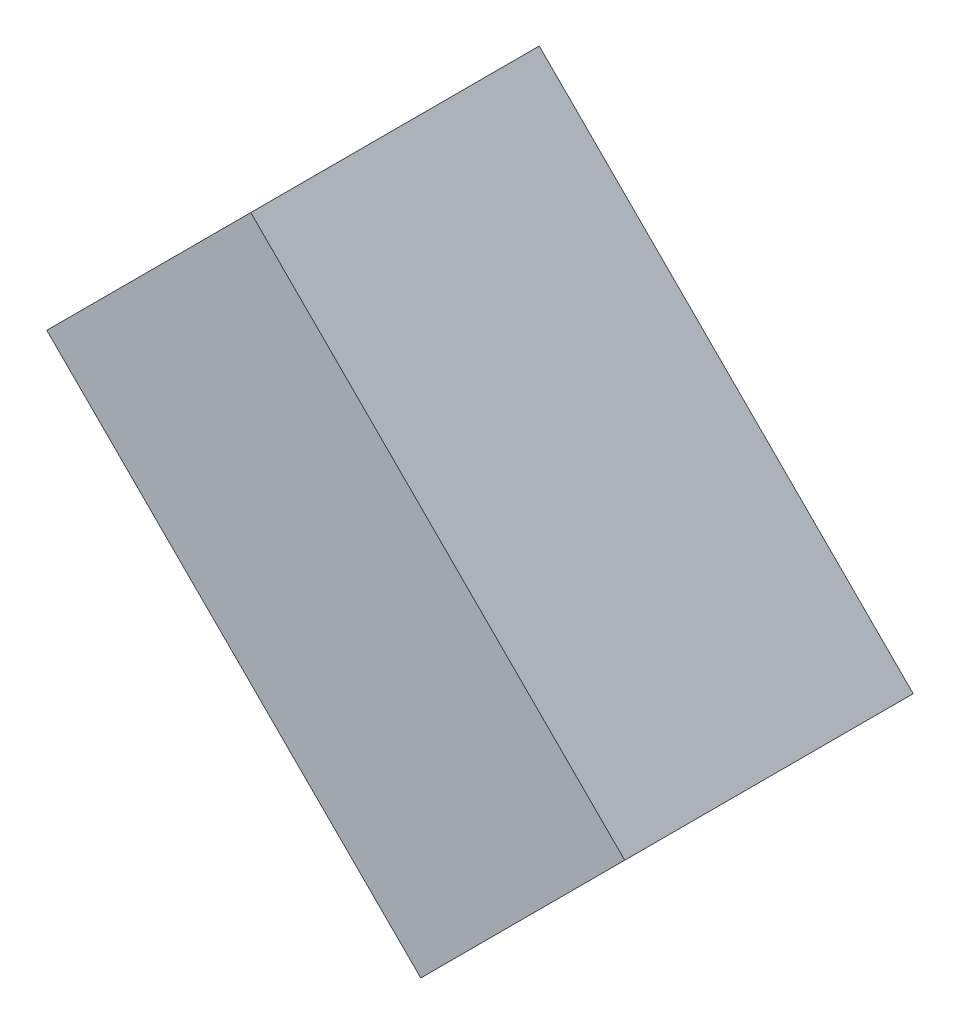
ISO-10303-21;
HEADER;
FILE_DESCRIPTION(('STEP AP214'),'2;1');
FILE_NAME('part.step','',(''),(''),'','','');
FILE_SCHEMA(('AUTOMOTIVE_DESIGN { 1 0 10303 214 1 1 1 1 }'));
ENDSEC;
DATA;
#1=APPLICATION_CONTEXT('core data for automotive mechanical design processes');
#2=APPLICATION_PROTOCOL_DEFINITION('international standard','automotive_design',2000,#1);
#3=PRODUCT_CONTEXT('',#1,'mechanical');
#4=PRODUCT('Part','Part','',(#3));
#5=PRODUCT_RELATED_PRODUCT_CATEGORY('part','',(#4));
#6=PRODUCT_DEFINITION_FORMATION('','',#4);
#7=PRODUCT_DEFINITION_CONTEXT('part definition',#1,'design');
#8=PRODUCT_DEFINITION('design','',#6,#7);
#9=PRODUCT_DEFINITION_SHAPE('','',#8);
#10=(LENGTH_UNIT() NAMED_UNIT(*) SI_UNIT(.MILLI.,.METRE.));
#11=(NAMED_UNIT(*) PLANE_ANGLE_UNIT() SI_UNIT($,.RADIAN.));
#12=(NAMED_UNIT(*) SI_UNIT($,.STERADIAN.) SOLID_ANGLE_UNIT());
#13=UNCERTAINTY_MEASURE_WITH_UNIT(LENGTH_MEASURE(1.E-05),#10,'distance_accuracy_value','');
#14=(GEOMETRIC_REPRESENTATION_CONTEXT(3) GLOBAL_UNCERTAINTY_ASSIGNED_CONTEXT((#13)) GLOBAL_UNIT_ASSIGNED_CONTEXT((#10,
#11,#12)) REPRESENTATION_CONTEXT('',''));
#15=CARTESIAN_POINT('',(0.,0.,0.));
#16=DIRECTION('',(0.,0.,1.));
#17=DIRECTION('',(1.,0.,0.));
#18=AXIS2_PLACEMENT_3D('',#15,#16,#17);
#19=CARTESIAN_POINT('',(0.26516584,-0.9015603,0.));
#20=DIRECTION('',(-0.707106011490129,-0.707107550882129,0.));
#21=DIRECTION('',(0.707107550882129,-0.707106011490129,0.));
#22=AXIS2_PLACEMENT_3D('',#19,#20,#21);
#23=PLANE('',#22);
#24=DIRECTION('',(0.,0.,1.));
#25=VECTOR('',#24,1.);
#26=CARTESIAN_POINT('',(-0.90156284,0.26516584,0.));
#27=LINE('',#26,#25);
#28=CARTESIAN_POINT('',(-0.901562839999932,0.265165840000068,0.));
#29=VERTEX_POINT('',#28);
#30=CARTESIAN_POINT('',(-0.901562839999932,0.265165840000068,0.90000074));
#31=VERTEX_POINT('',#30);
#32=EDGE_CURVE('E20',#29,#31,#27,.T.);
#33=ORIENTED_EDGE('',*,*,#32,.F.);
#34=DIRECTION('',(0.707107550882293,-0.707106011489964,0.));
#35=VECTOR('',#34,1.);
#36=CARTESIAN_POINT('',(-0.90156284,0.26516584,0.));
#37=LINE('',#36,#35);
#38=CARTESIAN_POINT('',(0.265165839999972,-0.901560299999972,0.));
#39=VERTEX_POINT('',#38);
#40=EDGE_CURVE('E81',#29,#39,#37,.T.);
#41=ORIENTED_EDGE('',*,*,#40,.T.);
#42=DIRECTION('',(0.,0.,1.));
#43=VECTOR('',#42,1.);
#44=CARTESIAN_POINT('',(0.265165839999945,-0.901560299999944,0.));
#45=LINE('',#44,#43);
#46=CARTESIAN_POINT('',(0.265165839999986,-0.901560299999986,0.90000074));
#47=VERTEX_POINT('',#46);
#48=EDGE_CURVE('E68',#47,#39,#45,.F.);
#49=ORIENTED_EDGE('',*,*,#48,.F.);
#50=DIRECTION('',(0.707107550882293,-0.707106011489964,0.));
#51=VECTOR('',#50,1.);
#52=CARTESIAN_POINT('',(-0.90156284,0.26516584,0.90000074));
#53=LINE('',#52,#51);
#54=EDGE_CURVE('E55',#31,#47,#53,.T.);
#55=ORIENTED_EDGE('',*,*,#54,.F.);
#56=EDGE_LOOP('',(#33,#41,#49,#55));
#57=FACE_BOUND('',#56,.T.);
#58=ADVANCED_FACE('F17',(#57),#23,.T.);
#59=CARTESIAN_POINT('',(-0.90156284,0.26516584,0.));
#60=DIRECTION('',(-0.707106781186548,0.707106781186548,0.));
#61=DIRECTION('',(-0.707106781186548,-0.707106781186548,0.));
#62=AXIS2_PLACEMENT_3D('',#59,#60,#61);
#63=PLANE('',#62);
#64=DIRECTION('',(0.,0.,1.));
#65=VECTOR('',#64,1.);
#66=CARTESIAN_POINT('',(-0.26516584,0.90156284,0.));
#67=LINE('',#66,#65);
#68=CARTESIAN_POINT('',(-0.26516584,0.90156284,0.));
#69=VERTEX_POINT('',#68);
#70=CARTESIAN_POINT('',(-0.26516584,0.90156284,0.90000074));
#71=VERTEX_POINT('',#70);
#72=EDGE_CURVE('E83',#69,#71,#67,.T.);
#73=ORIENTED_EDGE('',*,*,#72,.F.);
#74=DIRECTION('',(-0.707106781186547,-0.707106781186548,0.));
#75=VECTOR('',#74,1.);
#76=CARTESIAN_POINT('',(-0.26516584,0.90156284,0.));
#77=LINE('',#76,#75);
#78=EDGE_CURVE('E64',#69,#29,#77,.T.);
#79=ORIENTED_EDGE('',*,*,#78,.T.);
#80=ORIENTED_EDGE('',*,*,#32,.T.);
#81=DIRECTION('',(-0.707106781186547,-0.707106781186548,0.));
#82=VECTOR('',#81,1.);
#83=CARTESIAN_POINT('',(-0.26516584,0.90156284,0.90000074));
#84=LINE('',#83,#82);
#85=EDGE_CURVE('E61',#71,#31,#84,.T.);
#86=ORIENTED_EDGE('',*,*,#85,.F.);
#87=EDGE_LOOP('',(#73,#79,#80,#86));
#88=FACE_BOUND('',#87,.T.);
#89=ADVANCED_FACE('F60',(#88),#63,.T.);
#90=CARTESIAN_POINT('',(0.26516584,-0.9015603,0.90000074));
#91=DIRECTION('',(0.,0.,1.));
#92=DIRECTION('',(1.,0.,0.));
#93=AXIS2_PLACEMENT_3D('',#90,#91,#92);
#94=PLANE('',#93);
#95=ORIENTED_EDGE('',*,*,#85,.T.);
#96=ORIENTED_EDGE('',*,*,#54,.T.);
#97=DIRECTION('',(0.70710819229714,0.70710537007314,0.));
#98=VECTOR('',#97,1.);
#99=CARTESIAN_POINT('',(0.90156284,-0.26516584,0.90000074));
#100=LINE('',#99,#98);
#101=CARTESIAN_POINT('',(0.90156284,-0.26516584,0.90000074));
#102=VERTEX_POINT('',#101);
#103=EDGE_CURVE('E70',#102,#47,#100,.F.);
#104=ORIENTED_EDGE('',*,*,#103,.F.);
#105=DIRECTION('',(-0.707106781186548,0.707106781186548,0.));
#106=VECTOR('',#105,1.);
#107=CARTESIAN_POINT('',(-0.26516584,0.90156284,0.90000074));
#108=LINE('',#107,#106);
#109=EDGE_CURVE('E74',#71,#102,#108,.F.);
#110=ORIENTED_EDGE('',*,*,#109,.F.);
#111=EDGE_LOOP('',(#95,#96,#104,#110));
#112=FACE_BOUND('',#111,.T.);
#113=ADVANCED_FACE('F72',(#112),#94,.T.);
#114=CARTESIAN_POINT('',(0.90156284,-0.26516584,0.));
#115=DIRECTION('',(0.70710537007314,-0.70710819229714,0.));
#116=DIRECTION('',(0.70710819229714,0.70710537007314,0.));
#117=AXIS2_PLACEMENT_3D('',#114,#115,#116);
#118=PLANE('',#117);
#119=ORIENTED_EDGE('',*,*,#48,.T.);
#120=DIRECTION('',(0.707108192297078,0.707105370073201,0.));
#121=VECTOR('',#120,1.);
#122=CARTESIAN_POINT('',(0.26516584,-0.9015603,0.));
#123=LINE('',#122,#121);
#124=CARTESIAN_POINT('',(0.90156284,-0.26516584,0.));
#125=VERTEX_POINT('',#124);
#126=EDGE_CURVE('E35',#39,#125,#123,.T.);
#127=ORIENTED_EDGE('',*,*,#126,.T.);
#128=DIRECTION('',(0.,0.,1.));
#129=VECTOR('',#128,1.);
#130=CARTESIAN_POINT('',(0.90156284,-0.26516584,0.));
#131=LINE('',#130,#129);
#132=EDGE_CURVE('E26',#102,#125,#131,.F.);
#133=ORIENTED_EDGE('',*,*,#132,.F.);
#134=ORIENTED_EDGE('',*,*,#103,.T.);
#135=EDGE_LOOP('',(#119,#127,#133,#134));
#136=FACE_BOUND('',#135,.T.);
#137=ADVANCED_FACE('F89',(#136),#118,.T.);
#138=CARTESIAN_POINT('',(0.26516584,-0.9015603,0.));
#139=DIRECTION('',(0.,0.,1.));
#140=DIRECTION('',(1.,0.,0.));
#141=AXIS2_PLACEMENT_3D('',#138,#139,#140);
#142=PLANE('',#141);
#143=ORIENTED_EDGE('',*,*,#78,.F.);
#144=DIRECTION('',(-0.707106781186548,0.707106781186548,0.));
#145=VECTOR('',#144,1.);
#146=CARTESIAN_POINT('',(-0.26516584,0.90156284,0.));
#147=LINE('',#146,#145);
#148=EDGE_CURVE('E11',#125,#69,#147,.T.);
#149=ORIENTED_EDGE('',*,*,#148,.F.);
#150=ORIENTED_EDGE('',*,*,#126,.F.);
#151=ORIENTED_EDGE('',*,*,#40,.F.);
#152=EDGE_LOOP('',(#143,#149,#150,#151));
#153=FACE_BOUND('',#152,.T.);
#154=ADVANCED_FACE('F91',(#153),#142,.F.);
#155=CARTESIAN_POINT('',(-0.26516584,0.90156284,0.));
#156=DIRECTION('',(0.707106781186548,0.707106781186548,0.));
#157=DIRECTION('',(-0.707106781186548,0.707106781186548,0.));
#158=AXIS2_PLACEMENT_3D('',#155,#156,#157);
#159=PLANE('',#158);
#160=ORIENTED_EDGE('',*,*,#132,.T.);
#161=ORIENTED_EDGE('',*,*,#148,.T.);
#162=ORIENTED_EDGE('',*,*,#72,.T.);
#163=ORIENTED_EDGE('',*,*,#109,.T.);
#164=EDGE_LOOP('',(#160,#161,#162,#163));
#165=FACE_BOUND('',#164,.T.);
#166=ADVANCED_FACE('F88',(#165),#159,.T.);
#167=CLOSED_SHELL('',(#58,#89,#113,#137,#154,#166));
#168=MANIFOLD_SOLID_BREP('B1',#167);
#169=ADVANCED_BREP_SHAPE_REPRESENTATION('',(#18,#168),#14);
#170=SHAPE_DEFINITION_REPRESENTATION(#9,#169);
ENDSEC;
END-ISO-10303-21;
